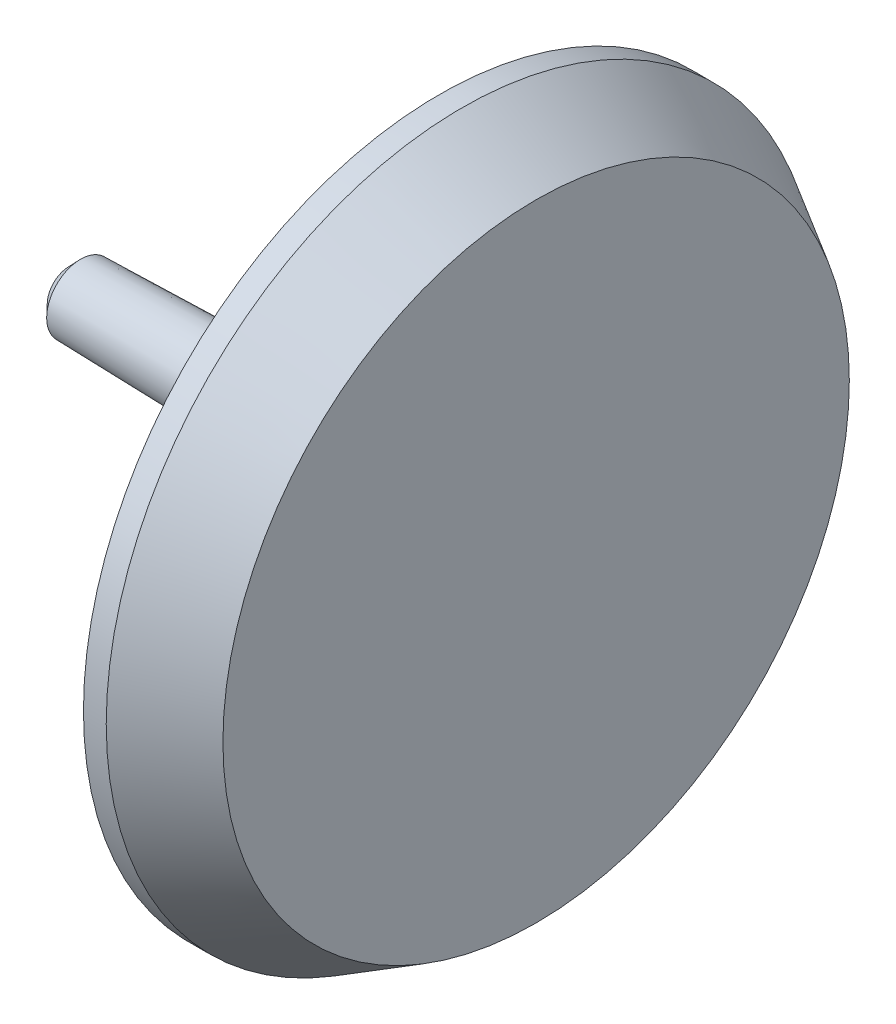
ISO-10303-21;
HEADER;
FILE_DESCRIPTION(('STEP AP214'),'2;1');
FILE_NAME('part.step','',(''),(''),'','','');
FILE_SCHEMA(('AUTOMOTIVE_DESIGN { 1 0 10303 214 1 1 1 1 }'));
ENDSEC;
DATA;
#1=APPLICATION_CONTEXT('core data for automotive mechanical design processes');
#2=APPLICATION_PROTOCOL_DEFINITION('international standard','automotive_design',2000,#1);
#3=PRODUCT_CONTEXT('',#1,'mechanical');
#4=PRODUCT('Part','Part','',(#3));
#5=PRODUCT_RELATED_PRODUCT_CATEGORY('part','',(#4));
#6=PRODUCT_DEFINITION_FORMATION('','',#4);
#7=PRODUCT_DEFINITION_CONTEXT('part definition',#1,'design');
#8=PRODUCT_DEFINITION('design','',#6,#7);
#9=PRODUCT_DEFINITION_SHAPE('','',#8);
#10=(LENGTH_UNIT() NAMED_UNIT(*) SI_UNIT(.MILLI.,.METRE.));
#11=(NAMED_UNIT(*) PLANE_ANGLE_UNIT() SI_UNIT($,.RADIAN.));
#12=(NAMED_UNIT(*) SI_UNIT($,.STERADIAN.) SOLID_ANGLE_UNIT());
#13=UNCERTAINTY_MEASURE_WITH_UNIT(LENGTH_MEASURE(1.E-05),#10,'distance_accuracy_value','');
#14=(GEOMETRIC_REPRESENTATION_CONTEXT(3) GLOBAL_UNCERTAINTY_ASSIGNED_CONTEXT((#13)) GLOBAL_UNIT_ASSIGNED_CONTEXT((#10,
#11,#12)) REPRESENTATION_CONTEXT('',''));
#15=CARTESIAN_POINT('',(0.,0.,0.));
#16=DIRECTION('',(0.,0.,1.));
#17=DIRECTION('',(1.,0.,0.));
#18=AXIS2_PLACEMENT_3D('',#15,#16,#17);
#19=CARTESIAN_POINT('',(104.14,0.,0.));
#20=DIRECTION('',(-1.,0.,0.));
#21=DIRECTION('',(0.,0.,1.));
#22=AXIS2_PLACEMENT_3D('',#19,#20,#21);
#23=PLANE('',#22);
#24=CARTESIAN_POINT('',(104.14,0.,0.));
#25=DIRECTION('',(-1.,0.,0.));
#26=DIRECTION('',(0.,0.,1.));
#27=AXIS2_PLACEMENT_3D('',#24,#25,#26);
#28=CIRCLE('',#27,69.85);
#29=CARTESIAN_POINT('',(104.14,0.,69.85));
#30=VERTEX_POINT('',#29);
#31=EDGE_CURVE('E60',#30,#30,#28,.T.);
#32=ORIENTED_EDGE('',*,*,#31,.F.);
#33=EDGE_LOOP('',(#32));
#34=FACE_BOUND('',#33,.T.);
#35=ADVANCED_FACE('F39',(#34),#23,.F.);
#36=CARTESIAN_POINT('',(104.14,0.,0.));
#37=DIRECTION('',(-1.,0.,0.));
#38=DIRECTION('',(0.,0.,1.));
#39=AXIS2_PLACEMENT_3D('',#36,#37,#38);
#40=CONICAL_SURFACE('',#39,69.85,0.5235987755983);
#41=CARTESIAN_POINT('',(87.6422160579065,0.,0.));
#42=DIRECTION('',(-1.,0.,0.));
#43=DIRECTION('',(0.,0.,1.));
#44=AXIS2_PLACEMENT_3D('',#41,#42,#43);
#45=CIRCLE('',#44,79.375);
#46=CARTESIAN_POINT('',(87.6422160579065,0.,79.375));
#47=VERTEX_POINT('',#46);
#48=EDGE_CURVE('E63',#47,#47,#45,.T.);
#49=ORIENTED_EDGE('',*,*,#48,.F.);
#50=EDGE_LOOP('',(#49));
#51=FACE_BOUND('',#50,.T.);
#52=ORIENTED_EDGE('',*,*,#31,.T.);
#53=EDGE_LOOP('',(#52));
#54=FACE_BOUND('',#53,.T.);
#55=ADVANCED_FACE('F91',(#51,#54),#40,.T.);
#56=CARTESIAN_POINT('',(-13.738402673952,0.,0.));
#57=DIRECTION('',(-1.,0.,0.));
#58=DIRECTION('',(0.,0.,1.));
#59=AXIS2_PLACEMENT_3D('',#56,#57,#58);
#60=CYLINDRICAL_SURFACE('',#59,79.375);
#61=CARTESIAN_POINT('',(82.5622160579065,0.,0.));
#62=DIRECTION('',(-1.,0.,0.));
#63=DIRECTION('',(0.,0.,1.));
#64=AXIS2_PLACEMENT_3D('',#61,#62,#63);
#65=CIRCLE('',#64,79.375);
#66=CARTESIAN_POINT('',(82.5622160579065,0.,-79.375));
#67=VERTEX_POINT('',#66);
#68=EDGE_CURVE('E66',#67,#67,#65,.T.);
#69=ORIENTED_EDGE('',*,*,#68,.F.);
#70=EDGE_LOOP('',(#69));
#71=FACE_BOUND('',#70,.T.);
#72=ORIENTED_EDGE('',*,*,#48,.T.);
#73=EDGE_LOOP('',(#72));
#74=FACE_BOUND('',#73,.T.);
#75=ADVANCED_FACE('F87',(#71,#74),#60,.T.);
#76=CARTESIAN_POINT('',(82.5622160579065,0.,0.));
#77=DIRECTION('',(1.,0.,0.));
#78=DIRECTION('',(0.,0.,-1.));
#79=AXIS2_PLACEMENT_3D('',#76,#77,#78);
#80=CONICAL_SURFACE('',#79,79.375,1.4094361094129);
#81=CARTESIAN_POINT('',(71.4670243649193,0.,0.));
#82=DIRECTION('',(1.,0.,0.));
#83=DIRECTION('',(0.,0.,-1.));
#84=AXIS2_PLACEMENT_3D('',#81,#82,#83);
#85=CIRCLE('',#84,11.2124213075829);
#86=CARTESIAN_POINT('',(71.4670243649193,0.,-11.2124213075829));
#87=VERTEX_POINT('',#86);
#88=EDGE_CURVE('E51',#87,#87,#85,.T.);
#89=CARTESIAN_POINT('',(71.4670243649193,0.,-11.2124213075829));
#90=CARTESIAN_POINT('',(71.5825992783879,0.,-11.9224481689622));
#91=CARTESIAN_POINT('',(71.6981741918565,0.,-12.6324750303416));
#92=CARTESIAN_POINT('',(71.9293240187937,0.,-14.0525287531003));
#93=CARTESIAN_POINT('',(72.0448989322623,0.,-14.7625556144796));
#94=CARTESIAN_POINT('',(72.2760487591996,0.,-16.1826093372383));
#95=CARTESIAN_POINT('',(72.3916236726682,0.,-16.8926361986177));
#96=CARTESIAN_POINT('',(72.6227734996054,0.,-18.3126899213763));
#97=CARTESIAN_POINT('',(72.738348413074,0.,-19.0227167827557));
#98=CARTESIAN_POINT('',(72.9694982400113,0.,-20.4427705055144));
#99=CARTESIAN_POINT('',(73.0850731534799,0.,-21.1527973668937));
#100=CARTESIAN_POINT('',(73.3162229804171,0.,-22.5728510896524));
#101=CARTESIAN_POINT('',(73.4317978938857,0.,-23.2828779510318));
#102=CARTESIAN_POINT('',(73.662947720823,0.,-24.7029316737905));
#103=CARTESIAN_POINT('',(73.7785226342916,0.,-25.4129585351698));
#104=CARTESIAN_POINT('',(74.0096724612288,0.,-26.8330122579285));
#105=CARTESIAN_POINT('',(74.1252473746975,0.,-27.5430391193078));
#106=CARTESIAN_POINT('',(74.3563972016347,0.,-28.9630928420665));
#107=CARTESIAN_POINT('',(74.4719721151033,0.,-29.6731197034459));
#108=CARTESIAN_POINT('',(74.7031219420405,0.,-31.0931734262046));
#109=CARTESIAN_POINT('',(74.8186968555092,0.,-31.8032002875839));
#110=CARTESIAN_POINT('',(75.0498466824464,0.,-33.2232540103426));
#111=CARTESIAN_POINT('',(75.165421595915,0.,-33.9332808717219));
#112=CARTESIAN_POINT('',(75.3965714228522,0.,-35.3533345944806));
#113=CARTESIAN_POINT('',(75.5121463363209,0.,-36.06336145586));
#114=CARTESIAN_POINT('',(75.7432961632581,0.,-37.4834151786187));
#115=CARTESIAN_POINT('',(75.8588710767267,0.,-38.193442039998));
#116=CARTESIAN_POINT('',(76.0900209036639,0.,-39.6134957627567));
#117=CARTESIAN_POINT('',(76.2055958171326,0.,-40.323522624136));
#118=CARTESIAN_POINT('',(76.4367456440698,0.,-41.7435763468947));
#119=CARTESIAN_POINT('',(76.5523205575384,0.,-42.4536032082741));
#120=CARTESIAN_POINT('',(76.7834703844756,0.,-43.8736569310328));
#121=CARTESIAN_POINT('',(76.8990452979443,0.,-44.5836837924121));
#122=CARTESIAN_POINT('',(77.1301951248815,0.,-46.0037375151708));
#123=CARTESIAN_POINT('',(77.2457700383501,0.,-46.7137643765502));
#124=CARTESIAN_POINT('',(77.4769198652873,0.,-48.1338180993088));
#125=CARTESIAN_POINT('',(77.592494778756,0.,-48.8438449606882));
#126=CARTESIAN_POINT('',(77.8236446056932,0.,-50.2638986834469));
#127=CARTESIAN_POINT('',(77.9392195191618,0.,-50.9739255448262));
#128=CARTESIAN_POINT('',(78.170369346099,0.,-52.3939792675849));
#129=CARTESIAN_POINT('',(78.2859442595677,0.,-53.1040061289643));
#130=CARTESIAN_POINT('',(78.5170940865049,0.,-54.524059851723));
#131=CARTESIAN_POINT('',(78.6326689999735,0.,-55.2340867131023));
#132=CARTESIAN_POINT('',(78.8638188269107,0.,-56.654140435861));
#133=CARTESIAN_POINT('',(78.9793937403794,0.,-57.3641672972403));
#134=CARTESIAN_POINT('',(79.2105435673166,0.,-58.784221019999));
#135=CARTESIAN_POINT('',(79.3261184807852,0.,-59.4942478813784));
#136=CARTESIAN_POINT('',(79.5572683077224,0.,-60.9143016041371));
#137=CARTESIAN_POINT('',(79.6728432211911,0.,-61.6243284655164));
#138=CARTESIAN_POINT('',(79.9039930481283,0.,-63.0443821882751));
#139=CARTESIAN_POINT('',(80.0195679615969,0.,-63.7544090496544));
#140=CARTESIAN_POINT('',(80.2507177885341,0.,-65.1744627724131));
#141=CARTESIAN_POINT('',(80.3662927020028,0.,-65.8844896337925));
#142=CARTESIAN_POINT('',(80.59744252894,0.,-67.3045433565512));
#143=CARTESIAN_POINT('',(80.7130174424086,0.,-68.0145702179305));
#144=CARTESIAN_POINT('',(80.9441672693459,0.,-69.4346239406892));
#145=CARTESIAN_POINT('',(81.0597421828145,0.,-70.1446508020686));
#146=CARTESIAN_POINT('',(81.2908920097517,0.,-71.5647045248272));
#147=CARTESIAN_POINT('',(81.4064669232203,0.,-72.2747313862066));
#148=CARTESIAN_POINT('',(81.6376167501575,0.,-73.6947851089653));
#149=CARTESIAN_POINT('',(81.7531916636262,0.,-74.4048119703446));
#150=CARTESIAN_POINT('',(81.9843414905634,0.,-75.8248656931033));
#151=CARTESIAN_POINT('',(82.099916404032,0.,-76.5348925544827));
#152=CARTESIAN_POINT('',(82.3310662309693,0.,-77.9549462772413));
#153=CARTESIAN_POINT('',(82.4466411444379,0.,-78.6649731386207));
#154=CARTESIAN_POINT('',(82.5622160579065,0.,-79.375));
#155=B_SPLINE_CURVE_WITH_KNOTS('',3,(#89,#90,#91,#92,#93,#94,#95,#96,#97,#98,#99,#100,#101,#102,
#103,#104,#105,#106,#107,#108,#109,#110,#111,#112,#113,#114,#115,#116,#117,#118,#119,#120,#121,
#122,#123,#124,#125,#126,#127,#128,#129,#130,#131,#132,#133,#134,#135,#136,#137,#138,#139,#140,
#141,#142,#143,#144,#145,#146,#147,#148,#149,#150,#151,#152,#153,#154),.UNSPECIFIED.,.F.,.F.,(4,
2,2,2,2,2,2,2,2,2,2,2,2,2,2,2,2,2,2,2,2,2,2,2,2,2,2,2,2,2,2,2,4),(0.,2.15811522874274,
4.31623045748549,6.47434568622823,8.63246091497097,10.7905761437137,12.9486913724565,
15.1068066011992,17.2649218299419,19.4230370586847,21.5811522874274,23.7392675161702,
25.8973827449129,28.0554979736557,30.2136132023984,32.3717284311411,34.5298436598839,
36.6879588886266,38.8460741173694,41.0041893461121,43.1623045748549,45.3204198035976,
47.4785350323403,49.6366502610831,51.7947654898258,53.9528807185686,56.1109959473113,
58.269111176054,60.4272264047968,62.5853416335395,64.7434568622823,66.901572091025,
69.0596873197678),.UNSPECIFIED.);
#156=EDGE_CURVE('BSEAM77',#87,#67,#155,.T.);
#157=ORIENTED_EDGE('',*,*,#88,.T.);
#158=ORIENTED_EDGE('',*,*,#68,.T.);
#159=ORIENTED_EDGE('',*,*,#156,.T.);
#160=ORIENTED_EDGE('',*,*,#156,.F.);
#161=EDGE_LOOP('',(#157,#159,#158,#160));
#162=FACE_BOUND('',#161,.T.);
#163=ADVANCED_FACE('F77',(#162),#80,.T.);
#164=CARTESIAN_POINT('',(-13.738402673952,0.,0.));
#165=DIRECTION('',(-1.,0.,0.));
#166=DIRECTION('',(0.,0.,1.));
#167=AXIS2_PLACEMENT_3D('',#164,#165,#166);
#168=CYLINDRICAL_SURFACE('',#167,9.0805);
#169=CARTESIAN_POINT('',(68.960019821486,0.,0.));
#170=DIRECTION('',(-1.,0.,0.));
#171=DIRECTION('',(0.,0.,1.));
#172=AXIS2_PLACEMENT_3D('',#169,#170,#171);
#173=CIRCLE('',#172,9.0805);
#174=CARTESIAN_POINT('',(68.960019821486,0.,9.0805));
#175=VERTEX_POINT('',#174);
#176=EDGE_CURVE('E55',#175,#175,#173,.T.);
#177=ORIENTED_EDGE('',*,*,#176,.T.);
#178=EDGE_LOOP('',(#177));
#179=FACE_BOUND('',#178,.T.);
#180=CARTESIAN_POINT('',(66.04,0.,0.));
#181=DIRECTION('',(-1.,0.,0.));
#182=DIRECTION('',(0.,0.,1.));
#183=AXIS2_PLACEMENT_3D('',#180,#181,#182);
#184=CIRCLE('',#183,9.0805);
#185=CARTESIAN_POINT('',(66.04,0.,9.0805));
#186=VERTEX_POINT('',#185);
#187=EDGE_CURVE('E69',#186,#186,#184,.T.);
#188=ORIENTED_EDGE('',*,*,#187,.F.);
#189=EDGE_LOOP('',(#188));
#190=FACE_BOUND('',#189,.T.);
#191=ADVANCED_FACE('F75',(#179,#190),#168,.T.);
#192=CARTESIAN_POINT('',(66.04,0.,0.));
#193=DIRECTION('',(1.,0.,0.));
#194=DIRECTION('',(0.,0.,-1.));
#195=AXIS2_PLACEMENT_3D('',#192,#193,#194);
#196=CONICAL_SURFACE('',#195,9.0805,0.0240338329537576);
#197=CARTESIAN_POINT('',(2.5392664513999,0.,0.));
#198=DIRECTION('',(-1.,0.,0.));
#199=DIRECTION('',(0.,0.,1.));
#200=AXIS2_PLACEMENT_3D('',#197,#198,#199);
#201=CIRCLE('',#200,7.55404005892788);
#202=CARTESIAN_POINT('',(2.5392664513999,0.,7.55404005892788));
#203=VERTEX_POINT('',#202);
#204=EDGE_CURVE('E10',#203,#203,#201,.F.);
#205=ORIENTED_EDGE('',*,*,#204,.T.);
#206=EDGE_LOOP('',(#205));
#207=FACE_BOUND('',#206,.T.);
#208=ORIENTED_EDGE('',*,*,#187,.T.);
#209=EDGE_LOOP('',(#208));
#210=FACE_BOUND('',#209,.T.);
#211=ADVANCED_FACE('F73',(#207,#210),#196,.T.);
#212=CARTESIAN_POINT('',(0.,0.,0.));
#213=DIRECTION('',(1.,0.,0.));
#214=DIRECTION('',(0.,0.,-1.));
#215=AXIS2_PLACEMENT_3D('',#212,#213,#214);
#216=PLANE('',#215);
#217=CARTESIAN_POINT('',(0.,0.,0.));
#218=DIRECTION('',(1.,0.,0.));
#219=DIRECTION('',(0.,0.,-1.));
#220=AXIS2_PLACEMENT_3D('',#217,#218,#219);
#221=CIRCLE('',#220,4.88968659021764);
#222=CARTESIAN_POINT('',(0.,0.,-4.88968659021764));
#223=VERTEX_POINT('',#222);
#224=EDGE_CURVE('E47',#223,#223,#221,.F.);
#225=ORIENTED_EDGE('',*,*,#224,.T.);
#226=EDGE_LOOP('',(#225));
#227=FACE_BOUND('',#226,.T.);
#228=ADVANCED_FACE('F85',(#227),#216,.F.);
#229=CARTESIAN_POINT('',(68.960019821486,0.,0.));
#230=DIRECTION('',(-1.,0.,0.));
#231=DIRECTION('',(0.,0.,1.));
#232=AXIS2_PLACEMENT_3D('',#229,#230,#231);
#233=TOROIDAL_SURFACE('',#232,11.6205,2.54);
#234=ORIENTED_EDGE('',*,*,#88,.F.);
#235=EDGE_LOOP('',(#234));
#236=FACE_BOUND('',#235,.T.);
#237=ORIENTED_EDGE('',*,*,#176,.F.);
#238=EDGE_LOOP('',(#237));
#239=FACE_BOUND('',#238,.T.);
#240=ADVANCED_FACE('F101',(#236,#239),#233,.F.);
#241=CARTESIAN_POINT('',(0.,0.,0.));
#242=DIRECTION('',(1.,0.,0.));
#243=DIRECTION('',(0.,0.,-1.));
#244=AXIS2_PLACEMENT_3D('',#241,#242,#243);
#245=CONICAL_SURFACE('',#244,4.88968659021764,0.809431996351206);
#246=ORIENTED_EDGE('',*,*,#204,.F.);
#247=EDGE_LOOP('',(#246));
#248=FACE_BOUND('',#247,.T.);
#249=ORIENTED_EDGE('',*,*,#224,.F.);
#250=EDGE_LOOP('',(#249));
#251=FACE_BOUND('',#250,.T.);
#252=ADVANCED_FACE('F42',(#248,#251),#245,.T.);
#253=CLOSED_SHELL('',(#35,#55,#75,#163,#191,#211,#228,#240,#252));
#254=MANIFOLD_SOLID_BREP('B2',#253);
#255=ADVANCED_BREP_SHAPE_REPRESENTATION('',(#18,#254),#14);
#256=SHAPE_DEFINITION_REPRESENTATION(#9,#255);
ENDSEC;
END-ISO-10303-21;
